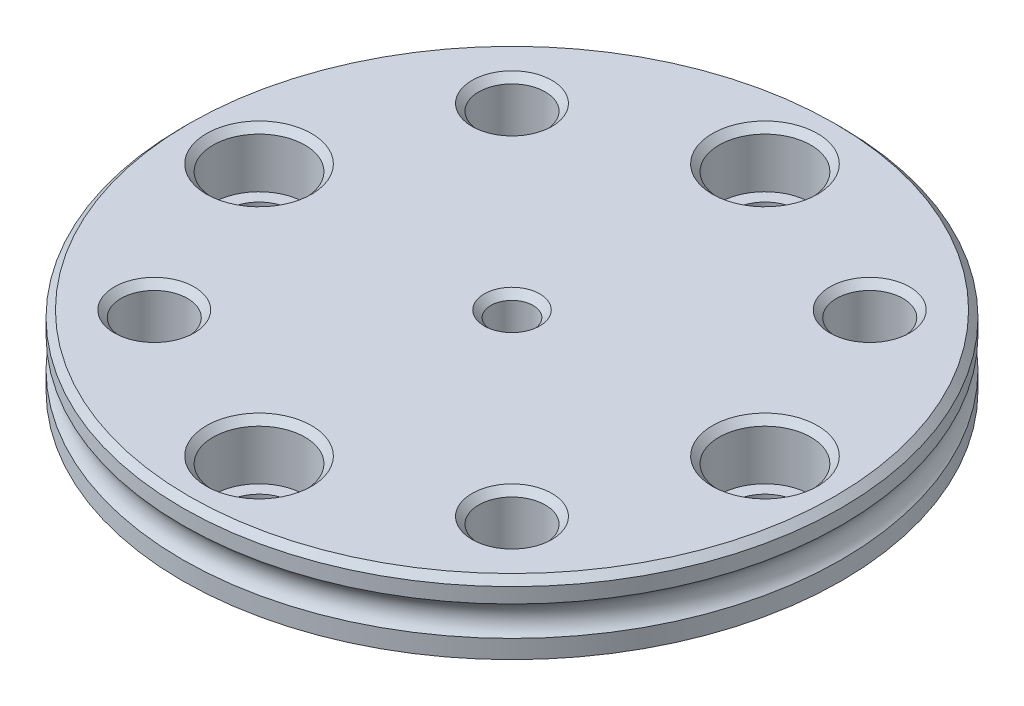
ISO-10303-21;
HEADER;
FILE_DESCRIPTION(('STEP AP214'),'2;1');
FILE_NAME('part.step','',(''),(''),'','','');
FILE_SCHEMA(('AUTOMOTIVE_DESIGN { 1 0 10303 214 1 1 1 1 }'));
ENDSEC;
DATA;
#1=APPLICATION_CONTEXT('core data for automotive mechanical design processes');
#2=APPLICATION_PROTOCOL_DEFINITION('international standard','automotive_design',2000,#1);
#3=PRODUCT_CONTEXT('',#1,'mechanical');
#4=PRODUCT('Part','Part','',(#3));
#5=PRODUCT_RELATED_PRODUCT_CATEGORY('part','',(#4));
#6=PRODUCT_DEFINITION_FORMATION('','',#4);
#7=PRODUCT_DEFINITION_CONTEXT('part definition',#1,'design');
#8=PRODUCT_DEFINITION('design','',#6,#7);
#9=PRODUCT_DEFINITION_SHAPE('','',#8);
#10=(LENGTH_UNIT() NAMED_UNIT(*) SI_UNIT(.MILLI.,.METRE.));
#11=(NAMED_UNIT(*) PLANE_ANGLE_UNIT() SI_UNIT($,.RADIAN.));
#12=(NAMED_UNIT(*) SI_UNIT($,.STERADIAN.) SOLID_ANGLE_UNIT());
#13=UNCERTAINTY_MEASURE_WITH_UNIT(LENGTH_MEASURE(1.E-05),#10,'distance_accuracy_value','');
#14=(GEOMETRIC_REPRESENTATION_CONTEXT(3) GLOBAL_UNCERTAINTY_ASSIGNED_CONTEXT((#13)) GLOBAL_UNIT_ASSIGNED_CONTEXT((#10,
#11,#12)) REPRESENTATION_CONTEXT('',''));
#15=CARTESIAN_POINT('',(0.,0.,0.));
#16=DIRECTION('',(0.,0.,1.));
#17=DIRECTION('',(1.,0.,0.));
#18=AXIS2_PLACEMENT_3D('',#15,#16,#17);
#19=CARTESIAN_POINT('',(-2.35454497529937E-12,-5.,19.));
#20=DIRECTION('',(0.,1.,0.));
#21=DIRECTION('',(0.,0.,1.));
#22=AXIS2_PLACEMENT_3D('',#19,#20,#21);
#23=CYLINDRICAL_SURFACE('',#22,2.5);
#24=CARTESIAN_POINT('',(-2.35454497529937E-12,-5.,19.));
#25=DIRECTION('',(0.,1.,0.));
#26=DIRECTION('',(0.,0.,1.));
#27=AXIS2_PLACEMENT_3D('',#24,#25,#26);
#28=CIRCLE('',#27,2.5);
#29=CARTESIAN_POINT('',(-2.35454497529937E-12,-5.,21.5));
#30=VERTEX_POINT('',#29);
#31=EDGE_CURVE('E171',#30,#30,#28,.T.);
#32=ORIENTED_EDGE('',*,*,#31,.F.);
#33=EDGE_LOOP('',(#32));
#34=FACE_BOUND('',#33,.T.);
#35=CARTESIAN_POINT('',(-2.35454497529937E-12,-4.,19.));
#36=DIRECTION('',(0.,1.,0.));
#37=DIRECTION('',(0.,0.,1.));
#38=AXIS2_PLACEMENT_3D('',#35,#36,#37);
#39=CIRCLE('',#38,2.5);
#40=CARTESIAN_POINT('',(-2.35454497529937E-12,-4.,21.5));
#41=VERTEX_POINT('',#40);
#42=EDGE_CURVE('E138',#41,#41,#39,.F.);
#43=ORIENTED_EDGE('',*,*,#42,.F.);
#44=EDGE_LOOP('',(#43));
#45=FACE_BOUND('',#44,.T.);
#46=ADVANCED_FACE('F48',(#34,#45),#23,.F.);
#47=CARTESIAN_POINT('',(-19.,-5.,-2.42088312073739E-12));
#48=DIRECTION('',(0.,1.,0.));
#49=DIRECTION('',(0.,0.,1.));
#50=AXIS2_PLACEMENT_3D('',#47,#48,#49);
#51=CYLINDRICAL_SURFACE('',#50,2.5);
#52=CARTESIAN_POINT('',(-19.,-5.,-2.42088312073739E-12));
#53=DIRECTION('',(0.,1.,0.));
#54=DIRECTION('',(0.,0.,1.));
#55=AXIS2_PLACEMENT_3D('',#52,#53,#54);
#56=CIRCLE('',#55,2.5);
#57=CARTESIAN_POINT('',(-19.,-5.,2.49999999999758));
#58=VERTEX_POINT('',#57);
#59=EDGE_CURVE('E175',#58,#58,#56,.T.);
#60=ORIENTED_EDGE('',*,*,#59,.F.);
#61=EDGE_LOOP('',(#60));
#62=FACE_BOUND('',#61,.T.);
#63=CARTESIAN_POINT('',(-19.,-4.,-2.42088312073739E-12));
#64=DIRECTION('',(0.,1.,0.));
#65=DIRECTION('',(0.,0.,1.));
#66=AXIS2_PLACEMENT_3D('',#63,#64,#65);
#67=CIRCLE('',#66,2.5);
#68=CARTESIAN_POINT('',(-19.,-4.,2.49999999999758));
#69=VERTEX_POINT('',#68);
#70=EDGE_CURVE('E143',#69,#69,#67,.F.);
#71=ORIENTED_EDGE('',*,*,#70,.F.);
#72=EDGE_LOOP('',(#71));
#73=FACE_BOUND('',#72,.T.);
#74=ADVANCED_FACE('F249',(#62,#73),#51,.F.);
#75=CARTESIAN_POINT('',(2.41644454835557E-12,-5.,-19.0000000000001));
#76=DIRECTION('',(0.,1.,0.));
#77=DIRECTION('',(0.,0.,1.));
#78=AXIS2_PLACEMENT_3D('',#75,#76,#77);
#79=CYLINDRICAL_SURFACE('',#78,2.5);
#80=CARTESIAN_POINT('',(2.41644454835557E-12,-5.,-19.0000000000001));
#81=DIRECTION('',(0.,1.,0.));
#82=DIRECTION('',(0.,0.,1.));
#83=AXIS2_PLACEMENT_3D('',#80,#81,#82);
#84=CIRCLE('',#83,2.5);
#85=CARTESIAN_POINT('',(2.41644454835557E-12,-5.,-16.5000000000001));
#86=VERTEX_POINT('',#85);
#87=EDGE_CURVE('E179',#86,#86,#84,.T.);
#88=ORIENTED_EDGE('',*,*,#87,.F.);
#89=EDGE_LOOP('',(#88));
#90=FACE_BOUND('',#89,.T.);
#91=CARTESIAN_POINT('',(2.41644454835557E-12,-4.,-19.0000000000001));
#92=DIRECTION('',(0.,1.,0.));
#93=DIRECTION('',(0.,0.,1.));
#94=AXIS2_PLACEMENT_3D('',#91,#92,#93);
#95=CIRCLE('',#94,2.5);
#96=CARTESIAN_POINT('',(2.41644454835557E-12,-4.,-16.5000000000001));
#97=VERTEX_POINT('',#96);
#98=EDGE_CURVE('E147',#97,#97,#95,.F.);
#99=ORIENTED_EDGE('',*,*,#98,.F.);
#100=EDGE_LOOP('',(#99));
#101=FACE_BOUND('',#100,.T.);
#102=ADVANCED_FACE('F255',(#90,#101),#79,.F.);
#103=CARTESIAN_POINT('',(19.0000000000001,-5.,2.3538210106167E-12));
#104=DIRECTION('',(0.,1.,0.));
#105=DIRECTION('',(0.,0.,1.));
#106=AXIS2_PLACEMENT_3D('',#103,#104,#105);
#107=CYLINDRICAL_SURFACE('',#106,2.5);
#108=CARTESIAN_POINT('',(19.0000000000001,-5.,2.3538210106167E-12));
#109=DIRECTION('',(0.,1.,0.));
#110=DIRECTION('',(0.,0.,1.));
#111=AXIS2_PLACEMENT_3D('',#108,#109,#110);
#112=CIRCLE('',#111,2.5);
#113=CARTESIAN_POINT('',(19.0000000000001,-5.,2.50000000000235));
#114=VERTEX_POINT('',#113);
#115=EDGE_CURVE('E183',#114,#114,#112,.T.);
#116=ORIENTED_EDGE('',*,*,#115,.F.);
#117=EDGE_LOOP('',(#116));
#118=FACE_BOUND('',#117,.T.);
#119=CARTESIAN_POINT('',(19.0000000000001,-4.,2.3538210106167E-12));
#120=DIRECTION('',(0.,1.,0.));
#121=DIRECTION('',(0.,0.,1.));
#122=AXIS2_PLACEMENT_3D('',#119,#120,#121);
#123=CIRCLE('',#122,2.5);
#124=CARTESIAN_POINT('',(19.0000000000001,-4.,2.50000000000235));
#125=VERTEX_POINT('',#124);
#126=EDGE_CURVE('E151',#125,#125,#123,.F.);
#127=ORIENTED_EDGE('',*,*,#126,.F.);
#128=EDGE_LOOP('',(#127));
#129=FACE_BOUND('',#128,.T.);
#130=ADVANCED_FACE('F266',(#118,#129),#107,.F.);
#131=CARTESIAN_POINT('',(13.4350288425445,-5.,13.4350288425444));
#132=DIRECTION('',(0.,1.,0.));
#133=DIRECTION('',(0.,0.,1.));
#134=AXIS2_PLACEMENT_3D('',#131,#132,#133);
#135=CYLINDRICAL_SURFACE('',#134,2.5);
#136=CARTESIAN_POINT('',(13.4350288425445,-0.250000000000011,13.4350288425444));
#137=DIRECTION('',(0.,1.,0.));
#138=DIRECTION('',(0.,0.,1.));
#139=AXIS2_PLACEMENT_3D('',#136,#137,#138);
#140=CIRCLE('',#139,2.5);
#141=CARTESIAN_POINT('',(13.4350288425445,-0.250000000000011,15.9350288425444));
#142=VERTEX_POINT('',#141);
#143=EDGE_CURVE('E85',#142,#142,#140,.T.);
#144=ORIENTED_EDGE('',*,*,#143,.T.);
#145=EDGE_LOOP('',(#144));
#146=FACE_BOUND('',#145,.T.);
#147=CARTESIAN_POINT('',(13.4350288425445,-5.,13.4350288425444));
#148=DIRECTION('',(0.,1.,0.));
#149=DIRECTION('',(0.,0.,1.));
#150=AXIS2_PLACEMENT_3D('',#147,#148,#149);
#151=CIRCLE('',#150,2.5);
#152=CARTESIAN_POINT('',(13.4350288425445,-5.,15.9350288425444));
#153=VERTEX_POINT('',#152);
#154=EDGE_CURVE('E137',#153,#153,#151,.T.);
#155=ORIENTED_EDGE('',*,*,#154,.F.);
#156=EDGE_LOOP('',(#155));
#157=FACE_BOUND('',#156,.T.);
#158=ADVANCED_FACE('F270',(#146,#157),#135,.F.);
#159=CARTESIAN_POINT('',(-13.4350288425444,-5.,13.4350288425445));
#160=DIRECTION('',(0.,1.,0.));
#161=DIRECTION('',(0.,0.,1.));
#162=AXIS2_PLACEMENT_3D('',#159,#160,#161);
#163=CYLINDRICAL_SURFACE('',#162,2.5);
#164=CARTESIAN_POINT('',(-13.4350288425444,-0.250000000000011,13.4350288425445));
#165=DIRECTION('',(0.,1.,0.));
#166=DIRECTION('',(0.,0.,1.));
#167=AXIS2_PLACEMENT_3D('',#164,#165,#166);
#168=CIRCLE('',#167,2.5);
#169=CARTESIAN_POINT('',(-13.4350288425444,-0.250000000000011,15.9350288425445));
#170=VERTEX_POINT('',#169);
#171=EDGE_CURVE('E62',#170,#170,#168,.T.);
#172=ORIENTED_EDGE('',*,*,#171,.T.);
#173=EDGE_LOOP('',(#172));
#174=FACE_BOUND('',#173,.T.);
#175=CARTESIAN_POINT('',(-13.4350288425444,-5.,13.4350288425445));
#176=DIRECTION('',(0.,1.,0.));
#177=DIRECTION('',(0.,0.,1.));
#178=AXIS2_PLACEMENT_3D('',#175,#176,#177);
#179=CIRCLE('',#178,2.5);
#180=CARTESIAN_POINT('',(-13.4350288425444,-5.,15.9350288425445));
#181=VERTEX_POINT('',#180);
#182=EDGE_CURVE('E159',#181,#181,#179,.T.);
#183=ORIENTED_EDGE('',*,*,#182,.F.);
#184=EDGE_LOOP('',(#183));
#185=FACE_BOUND('',#184,.T.);
#186=ADVANCED_FACE('F369',(#174,#185),#163,.F.);
#187=CARTESIAN_POINT('',(0.,-5.,0.));
#188=DIRECTION('',(0.,1.,0.));
#189=DIRECTION('',(0.,0.,1.));
#190=AXIS2_PLACEMENT_3D('',#187,#188,#189);
#191=CYLINDRICAL_SURFACE('',#190,1.5875);
#192=CARTESIAN_POINT('',(0.,-0.250000000000011,0.));
#193=DIRECTION('',(0.,1.,0.));
#194=DIRECTION('',(0.,0.,1.));
#195=AXIS2_PLACEMENT_3D('',#192,#193,#194);
#196=CIRCLE('',#195,1.5875);
#197=CARTESIAN_POINT('',(0.,-0.250000000000011,1.5875));
#198=VERTEX_POINT('',#197);
#199=EDGE_CURVE('E81',#198,#198,#196,.T.);
#200=ORIENTED_EDGE('',*,*,#199,.T.);
#201=EDGE_LOOP('',(#200));
#202=FACE_BOUND('',#201,.T.);
#203=CARTESIAN_POINT('',(0.,-5.,0.));
#204=DIRECTION('',(0.,1.,0.));
#205=DIRECTION('',(0.,0.,1.));
#206=AXIS2_PLACEMENT_3D('',#203,#204,#205);
#207=CIRCLE('',#206,1.5875);
#208=CARTESIAN_POINT('',(0.,-5.,1.5875));
#209=VERTEX_POINT('',#208);
#210=EDGE_CURVE('E163',#209,#209,#207,.T.);
#211=ORIENTED_EDGE('',*,*,#210,.F.);
#212=EDGE_LOOP('',(#211));
#213=FACE_BOUND('',#212,.T.);
#214=ADVANCED_FACE('F372',(#202,#213),#191,.F.);
#215=CARTESIAN_POINT('',(-13.4350288425444,-5.,-13.4350288425445));
#216=DIRECTION('',(0.,1.,0.));
#217=DIRECTION('',(0.,0.,1.));
#218=AXIS2_PLACEMENT_3D('',#215,#216,#217);
#219=CYLINDRICAL_SURFACE('',#218,2.5);
#220=CARTESIAN_POINT('',(-13.4350288425444,-0.250000000000011,-13.4350288425445));
#221=DIRECTION('',(0.,1.,0.));
#222=DIRECTION('',(0.,0.,1.));
#223=AXIS2_PLACEMENT_3D('',#220,#221,#222);
#224=CIRCLE('',#223,2.5);
#225=CARTESIAN_POINT('',(-13.4350288425444,-0.250000000000011,-10.9350288425445));
#226=VERTEX_POINT('',#225);
#227=EDGE_CURVE('E67',#226,#226,#224,.T.);
#228=ORIENTED_EDGE('',*,*,#227,.T.);
#229=EDGE_LOOP('',(#228));
#230=FACE_BOUND('',#229,.T.);
#231=CARTESIAN_POINT('',(-13.4350288425444,-5.,-13.4350288425445));
#232=DIRECTION('',(0.,1.,0.));
#233=DIRECTION('',(0.,0.,1.));
#234=AXIS2_PLACEMENT_3D('',#231,#232,#233);
#235=CIRCLE('',#234,2.5);
#236=CARTESIAN_POINT('',(-13.4350288425444,-5.,-10.9350288425445));
#237=VERTEX_POINT('',#236);
#238=EDGE_CURVE('E167',#237,#237,#235,.T.);
#239=ORIENTED_EDGE('',*,*,#238,.F.);
#240=EDGE_LOOP('',(#239));
#241=FACE_BOUND('',#240,.T.);
#242=ADVANCED_FACE('F261',(#230,#241),#219,.F.);
#243=CARTESIAN_POINT('',(13.4350288425445,-5.,-13.4350288425444));
#244=DIRECTION('',(0.,1.,0.));
#245=DIRECTION('',(0.,0.,1.));
#246=AXIS2_PLACEMENT_3D('',#243,#244,#245);
#247=CYLINDRICAL_SURFACE('',#246,2.5);
#248=CARTESIAN_POINT('',(13.4350288425445,-0.25000000000001,-13.4350288425444));
#249=DIRECTION('',(0.,1.,0.));
#250=DIRECTION('',(0.,0.,1.));
#251=AXIS2_PLACEMENT_3D('',#248,#249,#250);
#252=CIRCLE('',#251,2.5);
#253=CARTESIAN_POINT('',(13.4350288425445,-0.25000000000001,-10.9350288425444));
#254=VERTEX_POINT('',#253);
#255=EDGE_CURVE('E77',#254,#254,#252,.T.);
#256=ORIENTED_EDGE('',*,*,#255,.T.);
#257=EDGE_LOOP('',(#256));
#258=FACE_BOUND('',#257,.T.);
#259=CARTESIAN_POINT('',(13.4350288425445,-5.,-13.4350288425444));
#260=DIRECTION('',(0.,1.,0.));
#261=DIRECTION('',(0.,0.,1.));
#262=AXIS2_PLACEMENT_3D('',#259,#260,#261);
#263=CIRCLE('',#262,2.5);
#264=CARTESIAN_POINT('',(13.4350288425445,-5.,-10.9350288425444));
#265=VERTEX_POINT('',#264);
#266=EDGE_CURVE('E142',#265,#265,#263,.T.);
#267=ORIENTED_EDGE('',*,*,#266,.F.);
#268=EDGE_LOOP('',(#267));
#269=FACE_BOUND('',#268,.T.);
#270=ADVANCED_FACE('F272',(#258,#269),#247,.F.);
#271=CARTESIAN_POINT('',(0.,-5.,0.));
#272=DIRECTION('',(0.,1.,0.));
#273=DIRECTION('',(0.,0.,1.));
#274=AXIS2_PLACEMENT_3D('',#271,#272,#273);
#275=PLANE('',#274);
#276=ORIENTED_EDGE('',*,*,#266,.T.);
#277=EDGE_LOOP('',(#276));
#278=FACE_BOUND('',#277,.T.);
#279=ORIENTED_EDGE('',*,*,#115,.T.);
#280=EDGE_LOOP('',(#279));
#281=FACE_BOUND('',#280,.T.);
#282=ORIENTED_EDGE('',*,*,#87,.T.);
#283=EDGE_LOOP('',(#282));
#284=FACE_BOUND('',#283,.T.);
#285=ORIENTED_EDGE('',*,*,#59,.T.);
#286=EDGE_LOOP('',(#285));
#287=FACE_BOUND('',#286,.T.);
#288=ORIENTED_EDGE('',*,*,#31,.T.);
#289=EDGE_LOOP('',(#288));
#290=FACE_BOUND('',#289,.T.);
#291=ORIENTED_EDGE('',*,*,#238,.T.);
#292=EDGE_LOOP('',(#291));
#293=FACE_BOUND('',#292,.T.);
#294=ORIENTED_EDGE('',*,*,#210,.T.);
#295=EDGE_LOOP('',(#294));
#296=FACE_BOUND('',#295,.T.);
#297=ORIENTED_EDGE('',*,*,#182,.T.);
#298=EDGE_LOOP('',(#297));
#299=FACE_BOUND('',#298,.T.);
#300=ORIENTED_EDGE('',*,*,#154,.T.);
#301=EDGE_LOOP('',(#300));
#302=FACE_BOUND('',#301,.T.);
#303=CARTESIAN_POINT('',(0.,-5.00000000000002,0.));
#304=DIRECTION('',(0.,-1.,0.));
#305=DIRECTION('',(0.,0.,-1.));
#306=AXIS2_PLACEMENT_3D('',#303,#304,#305);
#307=CIRCLE('',#306,24.75);
#308=CARTESIAN_POINT('',(0.,-5.00000000000002,-24.75));
#309=VERTEX_POINT('',#308);
#310=EDGE_CURVE('E213',#309,#309,#307,.T.);
#311=ORIENTED_EDGE('',*,*,#310,.T.);
#312=EDGE_LOOP('',(#311));
#313=FACE_BOUND('',#312,.T.);
#314=ADVANCED_FACE('F218',(#278,#281,#284,#287,#290,#293,#296,#299,#302,#313),#275,.F.);
#315=CARTESIAN_POINT('',(-19.,-4.,-3.85849945229404E-13));
#316=DIRECTION('',(0.,1.,0.));
#317=DIRECTION('',(0.,0.,1.));
#318=AXIS2_PLACEMENT_3D('',#315,#316,#317);
#319=PLANE('',#318);
#320=CARTESIAN_POINT('',(-19.,-4.,-3.85849945229404E-13));
#321=DIRECTION('',(0.,1.,0.));
#322=DIRECTION('',(0.,0.,1.));
#323=AXIS2_PLACEMENT_3D('',#320,#321,#322);
#324=CIRCLE('',#323,3.45);
#325=CARTESIAN_POINT('',(-19.,-4.,3.44999999999961));
#326=VERTEX_POINT('',#325);
#327=EDGE_CURVE('E190',#326,#326,#324,.T.);
#328=ORIENTED_EDGE('',*,*,#327,.T.);
#329=EDGE_LOOP('',(#328));
#330=FACE_BOUND('',#329,.T.);
#331=ORIENTED_EDGE('',*,*,#70,.T.);
#332=EDGE_LOOP('',(#331));
#333=FACE_BOUND('',#332,.T.);
#334=ADVANCED_FACE('F378',(#330,#333),#319,.T.);
#335=CARTESIAN_POINT('',(-19.,-4.,-3.85849945229404E-13));
#336=DIRECTION('',(0.,1.,0.));
#337=DIRECTION('',(0.,0.,1.));
#338=AXIS2_PLACEMENT_3D('',#335,#336,#337);
#339=CYLINDRICAL_SURFACE('',#338,3.45);
#340=CARTESIAN_POINT('',(-19.,-0.249999999999994,-3.85849945229404E-13));
#341=DIRECTION('',(0.,1.,0.));
#342=DIRECTION('',(0.,0.,1.));
#343=AXIS2_PLACEMENT_3D('',#340,#341,#342);
#344=CIRCLE('',#343,3.45);
#345=CARTESIAN_POINT('',(-19.,-0.249999999999994,3.44999999999961));
#346=VERTEX_POINT('',#345);
#347=EDGE_CURVE('E57',#346,#346,#344,.T.);
#348=ORIENTED_EDGE('',*,*,#347,.T.);
#349=EDGE_LOOP('',(#348));
#350=FACE_BOUND('',#349,.T.);
#351=ORIENTED_EDGE('',*,*,#327,.F.);
#352=EDGE_LOOP('',(#351));
#353=FACE_BOUND('',#352,.T.);
#354=ADVANCED_FACE('F418',(#350,#353),#339,.F.);
#355=CARTESIAN_POINT('',(-3.19511799791384E-13,-4.,19.));
#356=DIRECTION('',(0.,1.,0.));
#357=DIRECTION('',(0.,0.,1.));
#358=AXIS2_PLACEMENT_3D('',#355,#356,#357);
#359=PLANE('',#358);
#360=CARTESIAN_POINT('',(-3.19511799791384E-13,-4.,19.));
#361=DIRECTION('',(0.,1.,0.));
#362=DIRECTION('',(0.,0.,1.));
#363=AXIS2_PLACEMENT_3D('',#360,#361,#362);
#364=CIRCLE('',#363,3.45);
#365=CARTESIAN_POINT('',(-3.19511799791384E-13,-4.,22.45));
#366=VERTEX_POINT('',#365);
#367=EDGE_CURVE('E194',#366,#366,#364,.T.);
#368=ORIENTED_EDGE('',*,*,#367,.T.);
#369=EDGE_LOOP('',(#368));
#370=FACE_BOUND('',#369,.T.);
#371=ORIENTED_EDGE('',*,*,#42,.T.);
#372=EDGE_LOOP('',(#371));
#373=FACE_BOUND('',#372,.T.);
#374=ADVANCED_FACE('F421',(#370,#373),#359,.T.);
#375=CARTESIAN_POINT('',(-3.19511799791384E-13,-4.,19.));
#376=DIRECTION('',(0.,1.,0.));
#377=DIRECTION('',(0.,0.,1.));
#378=AXIS2_PLACEMENT_3D('',#375,#376,#377);
#379=CYLINDRICAL_SURFACE('',#378,3.45);
#380=CARTESIAN_POINT('',(-3.19511799791384E-13,-0.250000000000013,19.));
#381=DIRECTION('',(0.,1.,0.));
#382=DIRECTION('',(0.,0.,1.));
#383=AXIS2_PLACEMENT_3D('',#380,#381,#382);
#384=CIRCLE('',#383,3.45);
#385=CARTESIAN_POINT('',(-3.19511799791384E-13,-0.250000000000013,22.45));
#386=VERTEX_POINT('',#385);
#387=EDGE_CURVE('E89',#386,#386,#384,.T.);
#388=ORIENTED_EDGE('',*,*,#387,.T.);
#389=EDGE_LOOP('',(#388));
#390=FACE_BOUND('',#389,.T.);
#391=ORIENTED_EDGE('',*,*,#367,.F.);
#392=EDGE_LOOP('',(#391));
#393=FACE_BOUND('',#392,.T.);
#394=ADVANCED_FACE('F427',(#390,#393),#379,.F.);
#395=CARTESIAN_POINT('',(19.,-4.,2.53173654353365E-13));
#396=DIRECTION('',(0.,1.,0.));
#397=DIRECTION('',(0.,0.,1.));
#398=AXIS2_PLACEMENT_3D('',#395,#396,#397);
#399=PLANE('',#398);
#400=CARTESIAN_POINT('',(19.,-4.,2.53173654353365E-13));
#401=DIRECTION('',(0.,1.,0.));
#402=DIRECTION('',(0.,0.,1.));
#403=AXIS2_PLACEMENT_3D('',#400,#401,#402);
#404=CIRCLE('',#403,3.45);
#405=CARTESIAN_POINT('',(19.,-4.,3.45000000000026));
#406=VERTEX_POINT('',#405);
#407=EDGE_CURVE('E199',#406,#406,#404,.T.);
#408=ORIENTED_EDGE('',*,*,#407,.T.);
#409=EDGE_LOOP('',(#408));
#410=FACE_BOUND('',#409,.T.);
#411=ORIENTED_EDGE('',*,*,#126,.T.);
#412=EDGE_LOOP('',(#411));
#413=FACE_BOUND('',#412,.T.);
#414=ADVANCED_FACE('F430',(#410,#413),#399,.T.);
#415=CARTESIAN_POINT('',(19.,-4.,2.53173654353365E-13));
#416=DIRECTION('',(0.,1.,0.));
#417=DIRECTION('',(0.,0.,1.));
#418=AXIS2_PLACEMENT_3D('',#415,#416,#417);
#419=CYLINDRICAL_SURFACE('',#418,3.45);
#420=CARTESIAN_POINT('',(19.,-0.249999999999991,2.53173654353365E-13));
#421=DIRECTION('',(0.,1.,0.));
#422=DIRECTION('',(0.,0.,1.));
#423=AXIS2_PLACEMENT_3D('',#420,#421,#422);
#424=CIRCLE('',#423,3.45);
#425=CARTESIAN_POINT('',(19.,-0.249999999999991,3.45000000000026));
#426=VERTEX_POINT('',#425);
#427=EDGE_CURVE('E10',#426,#426,#424,.T.);
#428=ORIENTED_EDGE('',*,*,#427,.T.);
#429=EDGE_LOOP('',(#428));
#430=FACE_BOUND('',#429,.T.);
#431=ORIENTED_EDGE('',*,*,#407,.F.);
#432=EDGE_LOOP('',(#431));
#433=FACE_BOUND('',#432,.T.);
#434=ADVANCED_FACE('F437',(#430,#433),#419,.F.);
#435=CARTESIAN_POINT('',(1.86835508915345E-13,-4.,-19.));
#436=DIRECTION('',(0.,1.,0.));
#437=DIRECTION('',(0.,0.,1.));
#438=AXIS2_PLACEMENT_3D('',#435,#436,#437);
#439=PLANE('',#438);
#440=CARTESIAN_POINT('',(1.86835508915345E-13,-4.,-19.));
#441=DIRECTION('',(0.,1.,0.));
#442=DIRECTION('',(0.,0.,1.));
#443=AXIS2_PLACEMENT_3D('',#440,#441,#442);
#444=CIRCLE('',#443,3.45);
#445=CARTESIAN_POINT('',(1.86835508915345E-13,-4.,-15.55));
#446=VERTEX_POINT('',#445);
#447=EDGE_CURVE('E155',#446,#446,#444,.T.);
#448=ORIENTED_EDGE('',*,*,#447,.T.);
#449=EDGE_LOOP('',(#448));
#450=FACE_BOUND('',#449,.T.);
#451=ORIENTED_EDGE('',*,*,#98,.T.);
#452=EDGE_LOOP('',(#451));
#453=FACE_BOUND('',#452,.T.);
#454=ADVANCED_FACE('F244',(#450,#453),#439,.T.);
#455=CARTESIAN_POINT('',(1.86835508915345E-13,-4.,-19.));
#456=DIRECTION('',(0.,1.,0.));
#457=DIRECTION('',(0.,0.,1.));
#458=AXIS2_PLACEMENT_3D('',#455,#456,#457);
#459=CYLINDRICAL_SURFACE('',#458,3.45);
#460=CARTESIAN_POINT('',(1.86835508915345E-13,-0.250000000000013,-19.));
#461=DIRECTION('',(0.,1.,0.));
#462=DIRECTION('',(0.,0.,1.));
#463=AXIS2_PLACEMENT_3D('',#460,#461,#462);
#464=CIRCLE('',#463,3.45);
#465=CARTESIAN_POINT('',(1.86835508915345E-13,-0.250000000000013,-15.55));
#466=VERTEX_POINT('',#465);
#467=EDGE_CURVE('E133',#466,#466,#464,.T.);
#468=ORIENTED_EDGE('',*,*,#467,.T.);
#469=EDGE_LOOP('',(#468));
#470=FACE_BOUND('',#469,.T.);
#471=ORIENTED_EDGE('',*,*,#447,.F.);
#472=EDGE_LOOP('',(#471));
#473=FACE_BOUND('',#472,.T.);
#474=ADVANCED_FACE('F235',(#470,#473),#459,.F.);
#475=CARTESIAN_POINT('',(0.,-2.5,0.));
#476=DIRECTION('',(0.,-1.,0.));
#477=DIRECTION('',(0.,0.,-1.));
#478=AXIS2_PLACEMENT_3D('',#475,#476,#477);
#479=CYLINDRICAL_SURFACE('',#478,24.75);
#480=CARTESIAN_POINT('',(0.,-0.250000000000025,0.));
#481=DIRECTION('',(0.,1.,0.));
#482=DIRECTION('',(0.,0.,1.));
#483=AXIS2_PLACEMENT_3D('',#480,#481,#482);
#484=CIRCLE('',#483,24.75);
#485=CARTESIAN_POINT('',(0.,-0.250000000000025,24.75));
#486=VERTEX_POINT('',#485);
#487=EDGE_CURVE('E73',#486,#486,#484,.F.);
#488=ORIENTED_EDGE('',*,*,#487,.T.);
#489=EDGE_LOOP('',(#488));
#490=FACE_BOUND('',#489,.T.);
#491=CARTESIAN_POINT('',(0.,-1.38196601125011,0.));
#492=DIRECTION('',(0.,-1.,0.));
#493=DIRECTION('',(0.,0.,-1.));
#494=AXIS2_PLACEMENT_3D('',#491,#492,#493);
#495=CIRCLE('',#494,24.75);
#496=CARTESIAN_POINT('',(0.,-1.38196601125011,-24.75));
#497=VERTEX_POINT('',#496);
#498=EDGE_CURVE('E195',#497,#497,#495,.T.);
#499=ORIENTED_EDGE('',*,*,#498,.F.);
#500=EDGE_LOOP('',(#499));
#501=FACE_BOUND('',#500,.T.);
#502=ADVANCED_FACE('F230',(#490,#501),#479,.T.);
#503=CARTESIAN_POINT('',(0.,-2.50000000000001,0.));
#504=DIRECTION('',(0.,-1.,0.));
#505=DIRECTION('',(0.,0.,-1.));
#506=AXIS2_PLACEMENT_3D('',#503,#504,#505);
#507=TOROIDAL_SURFACE('',#506,25.75,1.5);
#508=CARTESIAN_POINT('',(0.,-3.61803398874989,0.));
#509=DIRECTION('',(0.,-1.,0.));
#510=DIRECTION('',(0.,0.,-1.));
#511=AXIS2_PLACEMENT_3D('',#508,#509,#510);
#512=CIRCLE('',#511,24.75);
#513=CARTESIAN_POINT('',(0.,-3.61803398874989,-24.75));
#514=VERTEX_POINT('',#513);
#515=EDGE_CURVE('E209',#514,#514,#512,.T.);
#516=ORIENTED_EDGE('',*,*,#515,.F.);
#517=EDGE_LOOP('',(#516));
#518=FACE_BOUND('',#517,.T.);
#519=ORIENTED_EDGE('',*,*,#498,.T.);
#520=EDGE_LOOP('',(#519));
#521=FACE_BOUND('',#520,.T.);
#522=ADVANCED_FACE('F224',(#518,#521),#507,.F.);
#523=CARTESIAN_POINT('',(0.,-2.5,0.));
#524=DIRECTION('',(0.,-1.,0.));
#525=DIRECTION('',(0.,0.,-1.));
#526=AXIS2_PLACEMENT_3D('',#523,#524,#525);
#527=CYLINDRICAL_SURFACE('',#526,24.75);
#528=ORIENTED_EDGE('',*,*,#310,.F.);
#529=EDGE_LOOP('',(#528));
#530=FACE_BOUND('',#529,.T.);
#531=ORIENTED_EDGE('',*,*,#515,.T.);
#532=EDGE_LOOP('',(#531));
#533=FACE_BOUND('',#532,.T.);
#534=ADVANCED_FACE('F220',(#530,#533),#527,.T.);
#535=CARTESIAN_POINT('',(0.,0.25,0.));
#536=DIRECTION('',(0.,1.,0.));
#537=DIRECTION('',(0.,0.,1.));
#538=AXIS2_PLACEMENT_3D('',#535,#536,#537);
#539=PLANE('',#538);
#540=CARTESIAN_POINT('',(1.86835508915345E-13,0.25,-19.));
#541=DIRECTION('',(0.,1.,0.));
#542=DIRECTION('',(0.,0.,1.));
#543=AXIS2_PLACEMENT_3D('',#540,#541,#542);
#544=CIRCLE('',#543,3.95000000000002);
#545=CARTESIAN_POINT('',(1.86835508915345E-13,0.25,-15.05));
#546=VERTEX_POINT('',#545);
#547=EDGE_CURVE('E93',#546,#546,#544,.F.);
#548=ORIENTED_EDGE('',*,*,#547,.T.);
#549=EDGE_LOOP('',(#548));
#550=FACE_BOUND('',#549,.T.);
#551=CARTESIAN_POINT('',(-3.19511799791384E-13,0.25,19.));
#552=DIRECTION('',(0.,1.,0.));
#553=DIRECTION('',(0.,0.,1.));
#554=AXIS2_PLACEMENT_3D('',#551,#552,#553);
#555=CIRCLE('',#554,3.95000000000002);
#556=CARTESIAN_POINT('',(-3.19511799791384E-13,0.25,22.95));
#557=VERTEX_POINT('',#556);
#558=EDGE_CURVE('E97',#557,#557,#555,.F.);
#559=ORIENTED_EDGE('',*,*,#558,.T.);
#560=EDGE_LOOP('',(#559));
#561=FACE_BOUND('',#560,.T.);
#562=CARTESIAN_POINT('',(13.4350288425445,0.25,13.4350288425444));
#563=DIRECTION('',(0.,1.,0.));
#564=DIRECTION('',(0.,0.,1.));
#565=AXIS2_PLACEMENT_3D('',#562,#563,#564);
#566=CIRCLE('',#565,3.00000000000001);
#567=CARTESIAN_POINT('',(13.4350288425445,0.25,16.4350288425444));
#568=VERTEX_POINT('',#567);
#569=EDGE_CURVE('E101',#568,#568,#566,.F.);
#570=ORIENTED_EDGE('',*,*,#569,.T.);
#571=EDGE_LOOP('',(#570));
#572=FACE_BOUND('',#571,.T.);
#573=CARTESIAN_POINT('',(0.,0.25,0.));
#574=DIRECTION('',(0.,1.,0.));
#575=DIRECTION('',(0.,0.,1.));
#576=AXIS2_PLACEMENT_3D('',#573,#574,#575);
#577=CIRCLE('',#576,2.08750000000001);
#578=CARTESIAN_POINT('',(0.,0.25,2.08750000000001));
#579=VERTEX_POINT('',#578);
#580=EDGE_CURVE('E105',#579,#579,#577,.F.);
#581=ORIENTED_EDGE('',*,*,#580,.T.);
#582=EDGE_LOOP('',(#581));
#583=FACE_BOUND('',#582,.T.);
#584=CARTESIAN_POINT('',(13.4350288425445,0.25,-13.4350288425444));
#585=DIRECTION('',(0.,1.,0.));
#586=DIRECTION('',(0.,0.,1.));
#587=AXIS2_PLACEMENT_3D('',#584,#585,#586);
#588=CIRCLE('',#587,3.00000000000001);
#589=CARTESIAN_POINT('',(13.4350288425445,0.25,-10.4350288425444));
#590=VERTEX_POINT('',#589);
#591=EDGE_CURVE('E109',#590,#590,#588,.F.);
#592=ORIENTED_EDGE('',*,*,#591,.T.);
#593=EDGE_LOOP('',(#592));
#594=FACE_BOUND('',#593,.T.);
#595=CARTESIAN_POINT('',(0.,0.25,0.));
#596=DIRECTION('',(0.,1.,0.));
#597=DIRECTION('',(0.,0.,1.));
#598=AXIS2_PLACEMENT_3D('',#595,#596,#597);
#599=CIRCLE('',#598,24.25);
#600=CARTESIAN_POINT('',(0.,0.25,24.25));
#601=VERTEX_POINT('',#600);
#602=EDGE_CURVE('E113',#601,#601,#599,.T.);
#603=ORIENTED_EDGE('',*,*,#602,.T.);
#604=EDGE_LOOP('',(#603));
#605=FACE_BOUND('',#604,.T.);
#606=CARTESIAN_POINT('',(-13.4350288425444,0.25,-13.4350288425445));
#607=DIRECTION('',(0.,1.,0.));
#608=DIRECTION('',(0.,0.,1.));
#609=AXIS2_PLACEMENT_3D('',#606,#607,#608);
#610=CIRCLE('',#609,3.00000000000001);
#611=CARTESIAN_POINT('',(-13.4350288425444,0.25,-10.4350288425445));
#612=VERTEX_POINT('',#611);
#613=EDGE_CURVE('E117',#612,#612,#610,.F.);
#614=ORIENTED_EDGE('',*,*,#613,.T.);
#615=EDGE_LOOP('',(#614));
#616=FACE_BOUND('',#615,.T.);
#617=CARTESIAN_POINT('',(-13.4350288425444,0.25,13.4350288425445));
#618=DIRECTION('',(0.,1.,0.));
#619=DIRECTION('',(0.,0.,1.));
#620=AXIS2_PLACEMENT_3D('',#617,#618,#619);
#621=CIRCLE('',#620,3.00000000000001);
#622=CARTESIAN_POINT('',(-13.4350288425444,0.25,16.4350288425445));
#623=VERTEX_POINT('',#622);
#624=EDGE_CURVE('E121',#623,#623,#621,.F.);
#625=ORIENTED_EDGE('',*,*,#624,.T.);
#626=EDGE_LOOP('',(#625));
#627=FACE_BOUND('',#626,.T.);
#628=CARTESIAN_POINT('',(-19.,0.25,-3.85849945229404E-13));
#629=DIRECTION('',(0.,1.,0.));
#630=DIRECTION('',(0.,0.,1.));
#631=AXIS2_PLACEMENT_3D('',#628,#629,#630);
#632=CIRCLE('',#631,3.95);
#633=CARTESIAN_POINT('',(-19.,0.25,3.94999999999961));
#634=VERTEX_POINT('',#633);
#635=EDGE_CURVE('E125',#634,#634,#632,.F.);
#636=ORIENTED_EDGE('',*,*,#635,.T.);
#637=EDGE_LOOP('',(#636));
#638=FACE_BOUND('',#637,.T.);
#639=CARTESIAN_POINT('',(19.,0.25,2.53173654353365E-13));
#640=DIRECTION('',(0.,1.,0.));
#641=DIRECTION('',(0.,0.,1.));
#642=AXIS2_PLACEMENT_3D('',#639,#640,#641);
#643=CIRCLE('',#642,3.95);
#644=CARTESIAN_POINT('',(19.,0.25,3.95000000000025));
#645=VERTEX_POINT('',#644);
#646=EDGE_CURVE('E129',#645,#645,#643,.F.);
#647=ORIENTED_EDGE('',*,*,#646,.T.);
#648=EDGE_LOOP('',(#647));
#649=FACE_BOUND('',#648,.T.);
#650=ADVANCED_FACE('F223',(#550,#561,#572,#583,#594,#605,#616,#627,#638,#649),#539,.T.);
#651=CARTESIAN_POINT('',(1.86835508915345E-13,-0.250000000000013,-19.));
#652=DIRECTION('',(0.,1.,0.));
#653=DIRECTION('',(0.,0.,1.));
#654=AXIS2_PLACEMENT_3D('',#651,#652,#653);
#655=CONICAL_SURFACE('',#654,3.45,0.78539816339745);
#656=ORIENTED_EDGE('',*,*,#547,.F.);
#657=EDGE_LOOP('',(#656));
#658=FACE_BOUND('',#657,.T.);
#659=ORIENTED_EDGE('',*,*,#467,.F.);
#660=EDGE_LOOP('',(#659));
#661=FACE_BOUND('',#660,.T.);
#662=ADVANCED_FACE('F277',(#658,#661),#655,.F.);
#663=CARTESIAN_POINT('',(-3.19511799791384E-13,-0.250000000000013,19.));
#664=DIRECTION('',(0.,1.,0.));
#665=DIRECTION('',(0.,0.,1.));
#666=AXIS2_PLACEMENT_3D('',#663,#664,#665);
#667=CONICAL_SURFACE('',#666,3.45,0.78539816339745);
#668=ORIENTED_EDGE('',*,*,#558,.F.);
#669=EDGE_LOOP('',(#668));
#670=FACE_BOUND('',#669,.T.);
#671=ORIENTED_EDGE('',*,*,#387,.F.);
#672=EDGE_LOOP('',(#671));
#673=FACE_BOUND('',#672,.T.);
#674=ADVANCED_FACE('F283',(#670,#673),#667,.F.);
#675=CARTESIAN_POINT('',(13.4350288425445,-0.250000000000011,13.4350288425444));
#676=DIRECTION('',(0.,1.,0.));
#677=DIRECTION('',(0.,0.,1.));
#678=AXIS2_PLACEMENT_3D('',#675,#676,#677);
#679=CONICAL_SURFACE('',#678,2.5,0.785398163397447);
#680=ORIENTED_EDGE('',*,*,#569,.F.);
#681=EDGE_LOOP('',(#680));
#682=FACE_BOUND('',#681,.T.);
#683=ORIENTED_EDGE('',*,*,#143,.F.);
#684=EDGE_LOOP('',(#683));
#685=FACE_BOUND('',#684,.T.);
#686=ADVANCED_FACE('F290',(#682,#685),#679,.F.);
#687=CARTESIAN_POINT('',(0.,-0.250000000000011,0.));
#688=DIRECTION('',(0.,1.,0.));
#689=DIRECTION('',(0.,0.,1.));
#690=AXIS2_PLACEMENT_3D('',#687,#688,#689);
#691=CONICAL_SURFACE('',#690,1.5875,0.78539816339745);
#692=ORIENTED_EDGE('',*,*,#580,.F.);
#693=EDGE_LOOP('',(#692));
#694=FACE_BOUND('',#693,.T.);
#695=ORIENTED_EDGE('',*,*,#199,.F.);
#696=EDGE_LOOP('',(#695));
#697=FACE_BOUND('',#696,.T.);
#698=ADVANCED_FACE('F297',(#694,#697),#691,.F.);
#699=CARTESIAN_POINT('',(13.4350288425445,-0.25000000000001,-13.4350288425444));
#700=DIRECTION('',(0.,1.,0.));
#701=DIRECTION('',(0.,0.,1.));
#702=AXIS2_PLACEMENT_3D('',#699,#700,#701);
#703=CONICAL_SURFACE('',#702,2.5,0.785398163397445);
#704=ORIENTED_EDGE('',*,*,#591,.F.);
#705=EDGE_LOOP('',(#704));
#706=FACE_BOUND('',#705,.T.);
#707=ORIENTED_EDGE('',*,*,#255,.F.);
#708=EDGE_LOOP('',(#707));
#709=FACE_BOUND('',#708,.T.);
#710=ADVANCED_FACE('F304',(#706,#709),#703,.F.);
#711=CARTESIAN_POINT('',(0.,0.25,0.));
#712=DIRECTION('',(0.,-1.,0.));
#713=DIRECTION('',(0.,0.,-1.));
#714=AXIS2_PLACEMENT_3D('',#711,#712,#713);
#715=CONICAL_SURFACE('',#714,24.25,0.785398163397445);
#716=ORIENTED_EDGE('',*,*,#487,.F.);
#717=EDGE_LOOP('',(#716));
#718=FACE_BOUND('',#717,.T.);
#719=ORIENTED_EDGE('',*,*,#602,.F.);
#720=EDGE_LOOP('',(#719));
#721=FACE_BOUND('',#720,.T.);
#722=ADVANCED_FACE('F311',(#718,#721),#715,.T.);
#723=CARTESIAN_POINT('',(-13.4350288425444,-0.250000000000011,-13.4350288425445));
#724=DIRECTION('',(0.,1.,0.));
#725=DIRECTION('',(0.,0.,1.));
#726=AXIS2_PLACEMENT_3D('',#723,#724,#725);
#727=CONICAL_SURFACE('',#726,2.5,0.785398163397448);
#728=ORIENTED_EDGE('',*,*,#613,.F.);
#729=EDGE_LOOP('',(#728));
#730=FACE_BOUND('',#729,.T.);
#731=ORIENTED_EDGE('',*,*,#227,.F.);
#732=EDGE_LOOP('',(#731));
#733=FACE_BOUND('',#732,.T.);
#734=ADVANCED_FACE('F318',(#730,#733),#727,.F.);
#735=CARTESIAN_POINT('',(-13.4350288425444,-0.250000000000011,13.4350288425445));
#736=DIRECTION('',(0.,1.,0.));
#737=DIRECTION('',(0.,0.,1.));
#738=AXIS2_PLACEMENT_3D('',#735,#736,#737);
#739=CONICAL_SURFACE('',#738,2.5,0.785398163397446);
#740=ORIENTED_EDGE('',*,*,#624,.F.);
#741=EDGE_LOOP('',(#740));
#742=FACE_BOUND('',#741,.T.);
#743=ORIENTED_EDGE('',*,*,#171,.F.);
#744=EDGE_LOOP('',(#743));
#745=FACE_BOUND('',#744,.T.);
#746=ADVANCED_FACE('F325',(#742,#745),#739,.F.);
#747=CARTESIAN_POINT('',(-19.,-0.249999999999994,-3.85849945229404E-13));
#748=DIRECTION('',(0.,1.,0.));
#749=DIRECTION('',(0.,0.,1.));
#750=AXIS2_PLACEMENT_3D('',#747,#748,#749);
#751=CONICAL_SURFACE('',#750,3.45,0.78539816339745);
#752=ORIENTED_EDGE('',*,*,#635,.F.);
#753=EDGE_LOOP('',(#752));
#754=FACE_BOUND('',#753,.T.);
#755=ORIENTED_EDGE('',*,*,#347,.F.);
#756=EDGE_LOOP('',(#755));
#757=FACE_BOUND('',#756,.T.);
#758=ADVANCED_FACE('F331',(#754,#757),#751,.F.);
#759=CARTESIAN_POINT('',(19.,-0.249999999999991,2.53173654353365E-13));
#760=DIRECTION('',(0.,1.,0.));
#761=DIRECTION('',(0.,0.,1.));
#762=AXIS2_PLACEMENT_3D('',#759,#760,#761);
#763=CONICAL_SURFACE('',#762,3.45,0.78539816339745);
#764=ORIENTED_EDGE('',*,*,#646,.F.);
#765=EDGE_LOOP('',(#764));
#766=FACE_BOUND('',#765,.T.);
#767=ORIENTED_EDGE('',*,*,#427,.F.);
#768=EDGE_LOOP('',(#767));
#769=FACE_BOUND('',#768,.T.);
#770=ADVANCED_FACE('F51',(#766,#769),#763,.F.);
#771=CLOSED_SHELL('',(#46,#74,#102,#130,#158,#186,#214,#242,#270,#314,#334,#354,#374,#394,#414,
#434,#454,#474,#502,#522,#534,#650,#662,#674,#686,#698,#710,#722,#734,#746,#758,#770));
#772=MANIFOLD_SOLID_BREP('B2',#771);
#773=ADVANCED_BREP_SHAPE_REPRESENTATION('',(#18,#772),#14);
#774=SHAPE_DEFINITION_REPRESENTATION(#9,#773);
ENDSEC;
END-ISO-10303-21;
